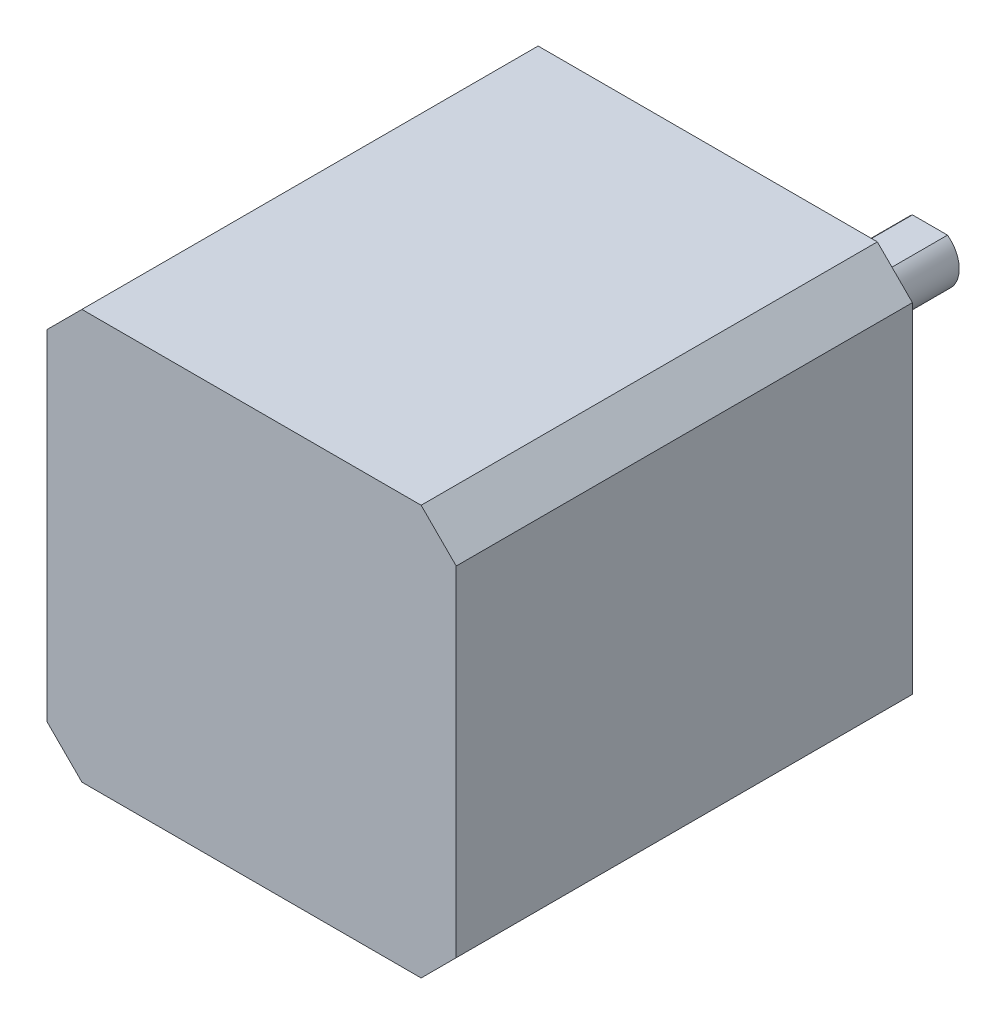
ISO-10303-21;
HEADER;
FILE_DESCRIPTION(('STEP AP214'),'2;1');
FILE_NAME('part.step','',(''),(''),'','','');
FILE_SCHEMA(('AUTOMOTIVE_DESIGN { 1 0 10303 214 1 1 1 1 }'));
ENDSEC;
DATA;
#1=APPLICATION_CONTEXT('core data for automotive mechanical design processes');
#2=APPLICATION_PROTOCOL_DEFINITION('international standard','automotive_design',2000,#1);
#3=PRODUCT_CONTEXT('',#1,'mechanical');
#4=PRODUCT('Part','Part','',(#3));
#5=PRODUCT_RELATED_PRODUCT_CATEGORY('part','',(#4));
#6=PRODUCT_DEFINITION_FORMATION('','',#4);
#7=PRODUCT_DEFINITION_CONTEXT('part definition',#1,'design');
#8=PRODUCT_DEFINITION('design','',#6,#7);
#9=PRODUCT_DEFINITION_SHAPE('','',#8);
#10=(LENGTH_UNIT() NAMED_UNIT(*) SI_UNIT(.MILLI.,.METRE.));
#11=(NAMED_UNIT(*) PLANE_ANGLE_UNIT() SI_UNIT($,.RADIAN.));
#12=(NAMED_UNIT(*) SI_UNIT($,.STERADIAN.) SOLID_ANGLE_UNIT());
#13=UNCERTAINTY_MEASURE_WITH_UNIT(LENGTH_MEASURE(1.E-05),#10,'distance_accuracy_value','');
#14=(GEOMETRIC_REPRESENTATION_CONTEXT(3) GLOBAL_UNCERTAINTY_ASSIGNED_CONTEXT((#13)) GLOBAL_UNIT_ASSIGNED_CONTEXT((#10,
#11,#12)) REPRESENTATION_CONTEXT('',''));
#15=CARTESIAN_POINT('',(0.,0.,0.));
#16=DIRECTION('',(0.,0.,1.));
#17=DIRECTION('',(1.,0.,0.));
#18=AXIS2_PLACEMENT_3D('',#15,#16,#17);
#19=CARTESIAN_POINT('',(17.5,-17.5,39.));
#20=DIRECTION('',(-1.,0.,0.));
#21=DIRECTION('',(0.,0.,1.));
#22=AXIS2_PLACEMENT_3D('',#19,#20,#21);
#23=PLANE('',#22);
#24=DIRECTION('',(0.,1.,0.));
#25=VECTOR('',#24,1.);
#26=CARTESIAN_POINT('',(17.5,-17.5,39.));
#27=LINE('',#26,#25);
#28=CARTESIAN_POINT('',(17.5,-14.5,39.));
#29=VERTEX_POINT('',#28);
#30=CARTESIAN_POINT('',(17.5,14.5,39.));
#31=VERTEX_POINT('',#30);
#32=EDGE_CURVE('E154',#29,#31,#27,.T.);
#33=ORIENTED_EDGE('',*,*,#32,.F.);
#34=DIRECTION('',(0.,0.,-1.));
#35=VECTOR('',#34,1.);
#36=CARTESIAN_POINT('',(17.5,-14.5,39.));
#37=LINE('',#36,#35);
#38=CARTESIAN_POINT('',(17.5,-14.5,0.));
#39=VERTEX_POINT('',#38);
#40=EDGE_CURVE('E174',#29,#39,#37,.T.);
#41=ORIENTED_EDGE('',*,*,#40,.T.);
#42=DIRECTION('',(0.,1.,0.));
#43=VECTOR('',#42,1.);
#44=CARTESIAN_POINT('',(17.5,-17.5,0.));
#45=LINE('',#44,#43);
#46=CARTESIAN_POINT('',(17.5,14.5,0.));
#47=VERTEX_POINT('',#46);
#48=EDGE_CURVE('E144',#39,#47,#45,.T.);
#49=ORIENTED_EDGE('',*,*,#48,.T.);
#50=DIRECTION('',(0.,0.,1.));
#51=VECTOR('',#50,1.);
#52=CARTESIAN_POINT('',(17.5,14.5,39.));
#53=LINE('',#52,#51);
#54=EDGE_CURVE('E152',#47,#31,#53,.T.);
#55=ORIENTED_EDGE('',*,*,#54,.T.);
#56=EDGE_LOOP('',(#33,#41,#49,#55));
#57=FACE_BOUND('',#56,.T.);
#58=ADVANCED_FACE('F43',(#57),#23,.F.);
#59=CARTESIAN_POINT('',(-17.5,17.5,39.));
#60=DIRECTION('',(0.,-1.,0.));
#61=DIRECTION('',(0.,0.,-1.));
#62=AXIS2_PLACEMENT_3D('',#59,#60,#61);
#63=PLANE('',#62);
#64=DIRECTION('',(-1.,0.,0.));
#65=VECTOR('',#64,1.);
#66=CARTESIAN_POINT('',(-17.5,17.5,0.));
#67=LINE('',#66,#65);
#68=CARTESIAN_POINT('',(14.5,17.5,0.));
#69=VERTEX_POINT('',#68);
#70=CARTESIAN_POINT('',(-14.5,17.5,0.));
#71=VERTEX_POINT('',#70);
#72=EDGE_CURVE('E166',#69,#71,#67,.T.);
#73=ORIENTED_EDGE('',*,*,#72,.T.);
#74=DIRECTION('',(0.,0.,1.));
#75=VECTOR('',#74,1.);
#76=CARTESIAN_POINT('',(-14.5,17.5,39.));
#77=LINE('',#76,#75);
#78=CARTESIAN_POINT('',(-14.5,17.5,39.));
#79=VERTEX_POINT('',#78);
#80=EDGE_CURVE('E11',#71,#79,#77,.T.);
#81=ORIENTED_EDGE('',*,*,#80,.T.);
#82=DIRECTION('',(-1.,0.,0.));
#83=VECTOR('',#82,1.);
#84=CARTESIAN_POINT('',(-17.5,17.5,39.));
#85=LINE('',#84,#83);
#86=CARTESIAN_POINT('',(14.5,17.5,39.));
#87=VERTEX_POINT('',#86);
#88=EDGE_CURVE('E157',#87,#79,#85,.T.);
#89=ORIENTED_EDGE('',*,*,#88,.F.);
#90=DIRECTION('',(0.,0.,-1.));
#91=VECTOR('',#90,1.);
#92=CARTESIAN_POINT('',(14.5,17.5,39.));
#93=LINE('',#92,#91);
#94=EDGE_CURVE('E52',#87,#69,#93,.T.);
#95=ORIENTED_EDGE('',*,*,#94,.T.);
#96=EDGE_LOOP('',(#73,#81,#89,#95));
#97=FACE_BOUND('',#96,.T.);
#98=ADVANCED_FACE('F205',(#97),#63,.F.);
#99=CARTESIAN_POINT('',(-17.5,-17.5,39.));
#100=DIRECTION('',(1.,0.,0.));
#101=DIRECTION('',(0.,0.,-1.));
#102=AXIS2_PLACEMENT_3D('',#99,#100,#101);
#103=PLANE('',#102);
#104=DIRECTION('',(0.,-1.,0.));
#105=VECTOR('',#104,1.);
#106=CARTESIAN_POINT('',(-17.5,-17.5,0.));
#107=LINE('',#106,#105);
#108=CARTESIAN_POINT('',(-17.5,14.5,0.));
#109=VERTEX_POINT('',#108);
#110=CARTESIAN_POINT('',(-17.5,-14.5,0.));
#111=VERTEX_POINT('',#110);
#112=EDGE_CURVE('E169',#109,#111,#107,.T.);
#113=ORIENTED_EDGE('',*,*,#112,.T.);
#114=DIRECTION('',(0.,0.,1.));
#115=VECTOR('',#114,1.);
#116=CARTESIAN_POINT('',(-17.5,-14.5,39.));
#117=LINE('',#116,#115);
#118=CARTESIAN_POINT('',(-17.5,-14.5,39.));
#119=VERTEX_POINT('',#118);
#120=EDGE_CURVE('E59',#111,#119,#117,.T.);
#121=ORIENTED_EDGE('',*,*,#120,.T.);
#122=DIRECTION('',(0.,-1.,0.));
#123=VECTOR('',#122,1.);
#124=CARTESIAN_POINT('',(-17.5,-17.5,39.));
#125=LINE('',#124,#123);
#126=CARTESIAN_POINT('',(-17.5,14.5,39.));
#127=VERTEX_POINT('',#126);
#128=EDGE_CURVE('E160',#127,#119,#125,.T.);
#129=ORIENTED_EDGE('',*,*,#128,.F.);
#130=DIRECTION('',(0.,0.,-1.));
#131=VECTOR('',#130,1.);
#132=CARTESIAN_POINT('',(-17.5,14.5,39.));
#133=LINE('',#132,#131);
#134=EDGE_CURVE('E197',#127,#109,#133,.T.);
#135=ORIENTED_EDGE('',*,*,#134,.T.);
#136=EDGE_LOOP('',(#113,#121,#129,#135));
#137=FACE_BOUND('',#136,.T.);
#138=ADVANCED_FACE('F216',(#137),#103,.F.);
#139=CARTESIAN_POINT('',(-17.5,-17.5,39.));
#140=DIRECTION('',(0.,1.,0.));
#141=DIRECTION('',(0.,0.,1.));
#142=AXIS2_PLACEMENT_3D('',#139,#140,#141);
#143=PLANE('',#142);
#144=DIRECTION('',(1.,0.,0.));
#145=VECTOR('',#144,1.);
#146=CARTESIAN_POINT('',(-17.5,-17.5,0.));
#147=LINE('',#146,#145);
#148=CARTESIAN_POINT('',(-14.5,-17.5,0.));
#149=VERTEX_POINT('',#148);
#150=CARTESIAN_POINT('',(14.5,-17.5,0.));
#151=VERTEX_POINT('',#150);
#152=EDGE_CURVE('E158',#149,#151,#147,.T.);
#153=ORIENTED_EDGE('',*,*,#152,.T.);
#154=DIRECTION('',(0.,0.,1.));
#155=VECTOR('',#154,1.);
#156=CARTESIAN_POINT('',(14.5,-17.5,39.));
#157=LINE('',#156,#155);
#158=CARTESIAN_POINT('',(14.5,-17.5,39.));
#159=VERTEX_POINT('',#158);
#160=EDGE_CURVE('E188',#151,#159,#157,.T.);
#161=ORIENTED_EDGE('',*,*,#160,.T.);
#162=DIRECTION('',(1.,0.,0.));
#163=VECTOR('',#162,1.);
#164=CARTESIAN_POINT('',(-17.5,-17.5,39.));
#165=LINE('',#164,#163);
#166=CARTESIAN_POINT('',(-14.5,-17.5,39.));
#167=VERTEX_POINT('',#166);
#168=EDGE_CURVE('E153',#167,#159,#165,.T.);
#169=ORIENTED_EDGE('',*,*,#168,.F.);
#170=DIRECTION('',(0.,0.,-1.));
#171=VECTOR('',#170,1.);
#172=CARTESIAN_POINT('',(-14.5,-17.5,39.));
#173=LINE('',#172,#171);
#174=EDGE_CURVE('E185',#167,#149,#173,.T.);
#175=ORIENTED_EDGE('',*,*,#174,.T.);
#176=EDGE_LOOP('',(#153,#161,#169,#175));
#177=FACE_BOUND('',#176,.T.);
#178=ADVANCED_FACE('F225',(#177),#143,.F.);
#179=CARTESIAN_POINT('',(0.,0.,39.));
#180=DIRECTION('',(0.,0.,-1.));
#181=DIRECTION('',(-1.,0.,0.));
#182=AXIS2_PLACEMENT_3D('',#179,#180,#181);
#183=PLANE('',#182);
#184=ORIENTED_EDGE('',*,*,#168,.T.);
#185=DIRECTION('',(-0.707106781186548,-0.707106781186547,0.));
#186=VECTOR('',#185,1.);
#187=CARTESIAN_POINT('',(17.5,-14.5,39.));
#188=LINE('',#187,#186);
#189=EDGE_CURVE('E195',#159,#29,#188,.F.);
#190=ORIENTED_EDGE('',*,*,#189,.T.);
#191=ORIENTED_EDGE('',*,*,#32,.T.);
#192=DIRECTION('',(0.707106781186547,-0.707106781186548,0.));
#193=VECTOR('',#192,1.);
#194=CARTESIAN_POINT('',(14.5,17.5,39.));
#195=LINE('',#194,#193);
#196=EDGE_CURVE('E190',#31,#87,#195,.F.);
#197=ORIENTED_EDGE('',*,*,#196,.T.);
#198=ORIENTED_EDGE('',*,*,#88,.T.);
#199=DIRECTION('',(0.707106781186548,0.707106781186547,0.));
#200=VECTOR('',#199,1.);
#201=CARTESIAN_POINT('',(-17.5,14.5,39.));
#202=LINE('',#201,#200);
#203=EDGE_CURVE('E66',#79,#127,#202,.F.);
#204=ORIENTED_EDGE('',*,*,#203,.T.);
#205=ORIENTED_EDGE('',*,*,#128,.T.);
#206=DIRECTION('',(-0.707106781186547,0.707106781186548,0.));
#207=VECTOR('',#206,1.);
#208=CARTESIAN_POINT('',(-14.5,-17.5,39.));
#209=LINE('',#208,#207);
#210=EDGE_CURVE('E193',#119,#167,#209,.F.);
#211=ORIENTED_EDGE('',*,*,#210,.T.);
#212=EDGE_LOOP('',(#184,#190,#191,#197,#198,#204,#205,#211));
#213=FACE_BOUND('',#212,.T.);
#214=ADVANCED_FACE('F218',(#213),#183,.F.);
#215=CARTESIAN_POINT('',(0.,0.,0.));
#216=DIRECTION('',(0.,0.,-1.));
#217=DIRECTION('',(-1.,0.,0.));
#218=AXIS2_PLACEMENT_3D('',#215,#216,#217);
#219=PLANE('',#218);
#220=CARTESIAN_POINT('',(0.,0.,0.));
#221=DIRECTION('',(0.,0.,-1.));
#222=DIRECTION('',(-1.,0.,0.));
#223=AXIS2_PLACEMENT_3D('',#220,#221,#222);
#224=CIRCLE('',#223,11.);
#225=CARTESIAN_POINT('',(-11.,0.,0.));
#226=VERTEX_POINT('',#225);
#227=EDGE_CURVE('E149',#226,#226,#224,.T.);
#228=ORIENTED_EDGE('',*,*,#227,.F.);
#229=EDGE_LOOP('',(#228));
#230=FACE_BOUND('',#229,.T.);
#231=ORIENTED_EDGE('',*,*,#48,.F.);
#232=DIRECTION('',(0.707106781186548,0.707106781186547,0.));
#233=VECTOR('',#232,1.);
#234=CARTESIAN_POINT('',(16.,-16.,0.));
#235=LINE('',#234,#233);
#236=EDGE_CURVE('E183',#39,#151,#235,.F.);
#237=ORIENTED_EDGE('',*,*,#236,.T.);
#238=ORIENTED_EDGE('',*,*,#152,.F.);
#239=DIRECTION('',(0.707106781186547,-0.707106781186548,0.));
#240=VECTOR('',#239,1.);
#241=CARTESIAN_POINT('',(-16.,-16.,0.));
#242=LINE('',#241,#240);
#243=EDGE_CURVE('E181',#149,#111,#242,.F.);
#244=ORIENTED_EDGE('',*,*,#243,.T.);
#245=ORIENTED_EDGE('',*,*,#112,.F.);
#246=DIRECTION('',(-0.707106781186548,-0.707106781186547,0.));
#247=VECTOR('',#246,1.);
#248=CARTESIAN_POINT('',(-16.,16.,0.));
#249=LINE('',#248,#247);
#250=EDGE_CURVE('E179',#109,#71,#249,.F.);
#251=ORIENTED_EDGE('',*,*,#250,.T.);
#252=ORIENTED_EDGE('',*,*,#72,.F.);
#253=DIRECTION('',(-0.707106781186547,0.707106781186548,0.));
#254=VECTOR('',#253,1.);
#255=CARTESIAN_POINT('',(16.,16.,0.));
#256=LINE('',#255,#254);
#257=EDGE_CURVE('E177',#69,#47,#256,.F.);
#258=ORIENTED_EDGE('',*,*,#257,.T.);
#259=EDGE_LOOP('',(#231,#237,#238,#244,#245,#251,#252,#258));
#260=FACE_BOUND('',#259,.T.);
#261=ADVANCED_FACE('F211',(#230,#260),#219,.T.);
#262=CARTESIAN_POINT('',(0.,0.,-2.));
#263=DIRECTION('',(0.,0.,1.));
#264=DIRECTION('',(1.,0.,0.));
#265=AXIS2_PLACEMENT_3D('',#262,#263,#264);
#266=CYLINDRICAL_SURFACE('',#265,11.);
#267=CARTESIAN_POINT('',(0.,0.,-2.));
#268=DIRECTION('',(0.,0.,-1.));
#269=DIRECTION('',(-1.,0.,0.));
#270=AXIS2_PLACEMENT_3D('',#267,#268,#269);
#271=CIRCLE('',#270,11.);
#272=CARTESIAN_POINT('',(-11.,0.,-2.));
#273=VERTEX_POINT('',#272);
#274=EDGE_CURVE('E141',#273,#273,#271,.T.);
#275=ORIENTED_EDGE('',*,*,#274,.F.);
#276=EDGE_LOOP('',(#275));
#277=FACE_BOUND('',#276,.T.);
#278=ORIENTED_EDGE('',*,*,#227,.T.);
#279=EDGE_LOOP('',(#278));
#280=FACE_BOUND('',#279,.T.);
#281=ADVANCED_FACE('F310',(#277,#280),#266,.T.);
#282=CARTESIAN_POINT('',(0.,0.,-2.));
#283=DIRECTION('',(0.,0.,-1.));
#284=DIRECTION('',(-1.,0.,0.));
#285=AXIS2_PLACEMENT_3D('',#282,#283,#284);
#286=PLANE('',#285);
#287=CARTESIAN_POINT('',(0.,0.,-2.));
#288=DIRECTION('',(0.,0.,-1.));
#289=DIRECTION('',(-1.,0.,0.));
#290=AXIS2_PLACEMENT_3D('',#287,#288,#289);
#291=CIRCLE('',#290,2.5);
#292=CARTESIAN_POINT('',(1.5,2.,-2.));
#293=VERTEX_POINT('',#292);
#294=CARTESIAN_POINT('',(-1.5,2.,-2.));
#295=VERTEX_POINT('',#294);
#296=EDGE_CURVE('E140',#293,#295,#291,.T.);
#297=ORIENTED_EDGE('',*,*,#296,.F.);
#298=DIRECTION('',(1.,0.,0.));
#299=VECTOR('',#298,1.);
#300=CARTESIAN_POINT('',(1.5,2.,-2.));
#301=LINE('',#300,#299);
#302=EDGE_CURVE('E137',#295,#293,#301,.T.);
#303=ORIENTED_EDGE('',*,*,#302,.F.);
#304=EDGE_LOOP('',(#297,#303));
#305=FACE_BOUND('',#304,.T.);
#306=ORIENTED_EDGE('',*,*,#274,.T.);
#307=EDGE_LOOP('',(#306));
#308=FACE_BOUND('',#307,.T.);
#309=ADVANCED_FACE('F302',(#305,#308),#286,.T.);
#310=CARTESIAN_POINT('',(0.,0.,-19.));
#311=DIRECTION('',(0.,0.,1.));
#312=DIRECTION('',(1.,0.,0.));
#313=AXIS2_PLACEMENT_3D('',#310,#311,#312);
#314=CYLINDRICAL_SURFACE('',#313,2.5);
#315=ORIENTED_EDGE('',*,*,#296,.T.);
#316=DIRECTION('',(0.,0.,1.));
#317=VECTOR('',#316,1.);
#318=CARTESIAN_POINT('',(-1.5,2.,-19.));
#319=LINE('',#318,#317);
#320=CARTESIAN_POINT('',(-1.5,2.,-19.));
#321=VERTEX_POINT('',#320);
#322=EDGE_CURVE('E127',#321,#295,#319,.T.);
#323=ORIENTED_EDGE('',*,*,#322,.F.);
#324=CARTESIAN_POINT('',(0.,0.,-19.));
#325=DIRECTION('',(0.,0.,-1.));
#326=DIRECTION('',(-1.,0.,0.));
#327=AXIS2_PLACEMENT_3D('',#324,#325,#326);
#328=CIRCLE('',#327,2.5);
#329=CARTESIAN_POINT('',(1.5,2.,-19.));
#330=VERTEX_POINT('',#329);
#331=EDGE_CURVE('E133',#330,#321,#328,.T.);
#332=ORIENTED_EDGE('',*,*,#331,.F.);
#333=DIRECTION('',(0.,0.,1.));
#334=VECTOR('',#333,1.);
#335=CARTESIAN_POINT('',(1.5,2.,-19.));
#336=LINE('',#335,#334);
#337=EDGE_CURVE('E130',#330,#293,#336,.T.);
#338=ORIENTED_EDGE('',*,*,#337,.T.);
#339=EDGE_LOOP('',(#315,#323,#332,#338));
#340=FACE_BOUND('',#339,.T.);
#341=ADVANCED_FACE('F139',(#340),#314,.T.);
#342=CARTESIAN_POINT('',(1.5,2.,-19.));
#343=DIRECTION('',(0.,-1.,0.));
#344=DIRECTION('',(0.,0.,-1.));
#345=AXIS2_PLACEMENT_3D('',#342,#343,#344);
#346=PLANE('',#345);
#347=ORIENTED_EDGE('',*,*,#302,.T.);
#348=ORIENTED_EDGE('',*,*,#337,.F.);
#349=DIRECTION('',(1.,0.,0.));
#350=VECTOR('',#349,1.);
#351=CARTESIAN_POINT('',(1.5,2.,-19.));
#352=LINE('',#351,#350);
#353=EDGE_CURVE('E122',#321,#330,#352,.T.);
#354=ORIENTED_EDGE('',*,*,#353,.F.);
#355=ORIENTED_EDGE('',*,*,#322,.T.);
#356=EDGE_LOOP('',(#347,#348,#354,#355));
#357=FACE_BOUND('',#356,.T.);
#358=ADVANCED_FACE('F125',(#357),#346,.F.);
#359=CARTESIAN_POINT('',(0.,0.,-19.));
#360=DIRECTION('',(0.,0.,-1.));
#361=DIRECTION('',(-1.,0.,0.));
#362=AXIS2_PLACEMENT_3D('',#359,#360,#361);
#363=PLANE('',#362);
#364=ORIENTED_EDGE('',*,*,#331,.T.);
#365=ORIENTED_EDGE('',*,*,#353,.T.);
#366=EDGE_LOOP('',(#364,#365));
#367=FACE_BOUND('',#366,.T.);
#368=ADVANCED_FACE('F135',(#367),#363,.T.);
#369=CARTESIAN_POINT('',(17.5,-14.5,39.));
#370=DIRECTION('',(-0.707106781186547,0.707106781186548,0.));
#371=DIRECTION('',(0.,0.,-1.));
#372=AXIS2_PLACEMENT_3D('',#369,#370,#371);
#373=PLANE('',#372);
#374=ORIENTED_EDGE('',*,*,#189,.F.);
#375=ORIENTED_EDGE('',*,*,#160,.F.);
#376=ORIENTED_EDGE('',*,*,#236,.F.);
#377=ORIENTED_EDGE('',*,*,#40,.F.);
#378=EDGE_LOOP('',(#374,#375,#376,#377));
#379=FACE_BOUND('',#378,.T.);
#380=ADVANCED_FACE('F230',(#379),#373,.F.);
#381=CARTESIAN_POINT('',(-14.5,-17.5,39.));
#382=DIRECTION('',(0.707106781186548,0.707106781186547,0.));
#383=DIRECTION('',(0.,0.,-1.));
#384=AXIS2_PLACEMENT_3D('',#381,#382,#383);
#385=PLANE('',#384);
#386=ORIENTED_EDGE('',*,*,#210,.F.);
#387=ORIENTED_EDGE('',*,*,#120,.F.);
#388=ORIENTED_EDGE('',*,*,#243,.F.);
#389=ORIENTED_EDGE('',*,*,#174,.F.);
#390=EDGE_LOOP('',(#386,#387,#388,#389));
#391=FACE_BOUND('',#390,.T.);
#392=ADVANCED_FACE('F222',(#391),#385,.F.);
#393=CARTESIAN_POINT('',(-17.5,14.5,39.));
#394=DIRECTION('',(0.707106781186547,-0.707106781186548,0.));
#395=DIRECTION('',(0.,0.,-1.));
#396=AXIS2_PLACEMENT_3D('',#393,#394,#395);
#397=PLANE('',#396);
#398=ORIENTED_EDGE('',*,*,#203,.F.);
#399=ORIENTED_EDGE('',*,*,#80,.F.);
#400=ORIENTED_EDGE('',*,*,#250,.F.);
#401=ORIENTED_EDGE('',*,*,#134,.F.);
#402=EDGE_LOOP('',(#398,#399,#400,#401));
#403=FACE_BOUND('',#402,.T.);
#404=ADVANCED_FACE('F215',(#403),#397,.F.);
#405=CARTESIAN_POINT('',(14.5,17.5,39.));
#406=DIRECTION('',(-0.707106781186548,-0.707106781186547,0.));
#407=DIRECTION('',(0.,0.,-1.));
#408=AXIS2_PLACEMENT_3D('',#405,#406,#407);
#409=PLANE('',#408);
#410=ORIENTED_EDGE('',*,*,#196,.F.);
#411=ORIENTED_EDGE('',*,*,#54,.F.);
#412=ORIENTED_EDGE('',*,*,#257,.F.);
#413=ORIENTED_EDGE('',*,*,#94,.F.);
#414=EDGE_LOOP('',(#410,#411,#412,#413));
#415=FACE_BOUND('',#414,.T.);
#416=ADVANCED_FACE('F46',(#415),#409,.F.);
#417=CLOSED_SHELL('',(#58,#98,#138,#178,#214,#261,#281,#309,#341,#358,#368,#380,#392,#404,#416));
#418=MANIFOLD_SOLID_BREP('B2',#417);
#419=ADVANCED_BREP_SHAPE_REPRESENTATION('',(#18,#418),#14);
#420=SHAPE_DEFINITION_REPRESENTATION(#9,#419);
ENDSEC;
END-ISO-10303-21;
